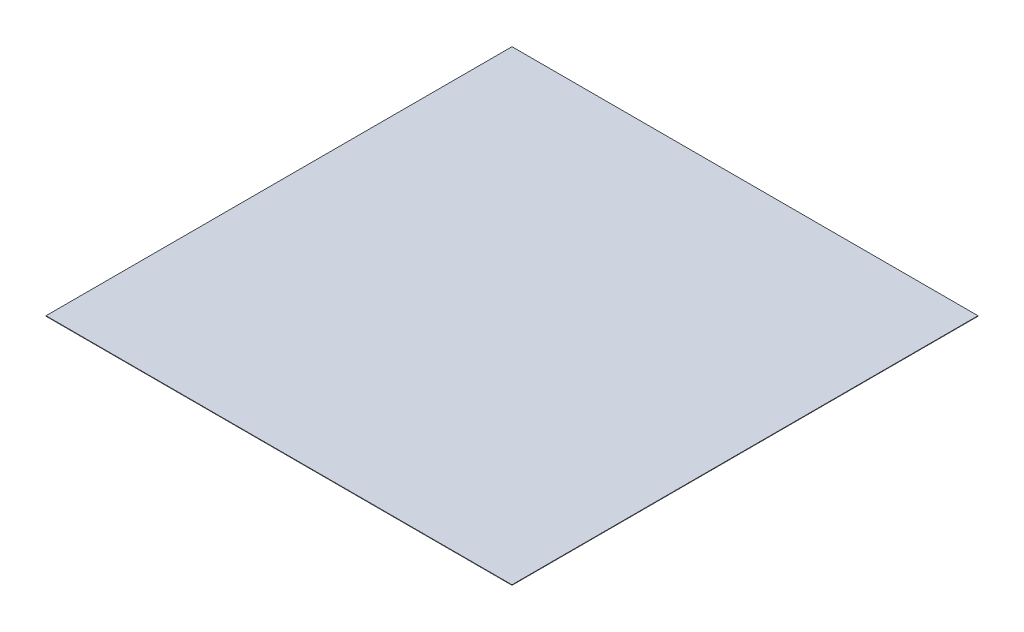
ISO-10303-21;
HEADER;
FILE_DESCRIPTION(('STEP AP214'),'2;1');
FILE_NAME('part.step','',(''),(''),'','','');
FILE_SCHEMA(('AUTOMOTIVE_DESIGN { 1 0 10303 214 1 1 1 1 }'));
ENDSEC;
DATA;
#1=APPLICATION_CONTEXT('core data for automotive mechanical design processes');
#2=APPLICATION_PROTOCOL_DEFINITION('international standard','automotive_design',2000,#1);
#3=PRODUCT_CONTEXT('',#1,'mechanical');
#4=PRODUCT('Part','Part','',(#3));
#5=PRODUCT_RELATED_PRODUCT_CATEGORY('part','',(#4));
#6=PRODUCT_DEFINITION_FORMATION('','',#4);
#7=PRODUCT_DEFINITION_CONTEXT('part definition',#1,'design');
#8=PRODUCT_DEFINITION('design','',#6,#7);
#9=PRODUCT_DEFINITION_SHAPE('','',#8);
#10=(LENGTH_UNIT() NAMED_UNIT(*) SI_UNIT(.MILLI.,.METRE.));
#11=(NAMED_UNIT(*) PLANE_ANGLE_UNIT() SI_UNIT($,.RADIAN.));
#12=(NAMED_UNIT(*) SI_UNIT($,.STERADIAN.) SOLID_ANGLE_UNIT());
#13=UNCERTAINTY_MEASURE_WITH_UNIT(LENGTH_MEASURE(1.E-05),#10,'distance_accuracy_value','');
#14=(GEOMETRIC_REPRESENTATION_CONTEXT(3) GLOBAL_UNCERTAINTY_ASSIGNED_CONTEXT((#13)) GLOBAL_UNIT_ASSIGNED_CONTEXT((#10,
#11,#12)) REPRESENTATION_CONTEXT('',''));
#15=CARTESIAN_POINT('',(0.,0.,0.));
#16=DIRECTION('',(0.,0.,1.));
#17=DIRECTION('',(1.,0.,0.));
#18=AXIS2_PLACEMENT_3D('',#15,#16,#17);
#19=CARTESIAN_POINT('',(5000.,10.,5000.));
#20=DIRECTION('',(-1.,0.,0.));
#21=DIRECTION('',(0.,0.,1.));
#22=AXIS2_PLACEMENT_3D('',#19,#20,#21);
#23=PLANE('',#22);
#24=DIRECTION('',(0.,0.,-1.));
#25=VECTOR('',#24,1.);
#26=CARTESIAN_POINT('',(5000.,0.,5000.));
#27=LINE('',#26,#25);
#28=CARTESIAN_POINT('',(5000.,0.,5000.));
#29=VERTEX_POINT('',#28);
#30=CARTESIAN_POINT('',(5000.,0.,-5000.));
#31=VERTEX_POINT('',#30);
#32=EDGE_CURVE('E100',#29,#31,#27,.T.);
#33=ORIENTED_EDGE('',*,*,#32,.T.);
#34=DIRECTION('',(0.,-1.,0.));
#35=VECTOR('',#34,1.);
#36=CARTESIAN_POINT('',(5000.,10.,-5000.));
#37=LINE('',#36,#35);
#38=CARTESIAN_POINT('',(5000.,10.,-5000.));
#39=VERTEX_POINT('',#38);
#40=EDGE_CURVE('E11',#39,#31,#37,.T.);
#41=ORIENTED_EDGE('',*,*,#40,.F.);
#42=DIRECTION('',(0.,0.,-1.));
#43=VECTOR('',#42,1.);
#44=CARTESIAN_POINT('',(5000.,10.,5000.));
#45=LINE('',#44,#43);
#46=CARTESIAN_POINT('',(5000.,10.,5000.));
#47=VERTEX_POINT('',#46);
#48=EDGE_CURVE('E88',#47,#39,#45,.T.);
#49=ORIENTED_EDGE('',*,*,#48,.F.);
#50=DIRECTION('',(0.,-1.,0.));
#51=VECTOR('',#50,1.);
#52=CARTESIAN_POINT('',(5000.,10.,5000.));
#53=LINE('',#52,#51);
#54=EDGE_CURVE('E96',#47,#29,#53,.T.);
#55=ORIENTED_EDGE('',*,*,#54,.T.);
#56=EDGE_LOOP('',(#33,#41,#49,#55));
#57=FACE_BOUND('',#56,.T.);
#58=ADVANCED_FACE('F37',(#57),#23,.F.);
#59=CARTESIAN_POINT('',(-5000.,10.,-5000.));
#60=DIRECTION('',(0.,0.,1.));
#61=DIRECTION('',(1.,0.,0.));
#62=AXIS2_PLACEMENT_3D('',#59,#60,#61);
#63=PLANE('',#62);
#64=DIRECTION('',(-1.,0.,0.));
#65=VECTOR('',#64,1.);
#66=CARTESIAN_POINT('',(-5000.,0.,-5000.));
#67=LINE('',#66,#65);
#68=CARTESIAN_POINT('',(-5000.,0.,-5000.));
#69=VERTEX_POINT('',#68);
#70=EDGE_CURVE('E92',#31,#69,#67,.T.);
#71=ORIENTED_EDGE('',*,*,#70,.T.);
#72=DIRECTION('',(0.,-1.,0.));
#73=VECTOR('',#72,1.);
#74=CARTESIAN_POINT('',(-5000.,10.,-5000.));
#75=LINE('',#74,#73);
#76=CARTESIAN_POINT('',(-5000.,10.,-5000.));
#77=VERTEX_POINT('',#76);
#78=EDGE_CURVE('E45',#77,#69,#75,.T.);
#79=ORIENTED_EDGE('',*,*,#78,.F.);
#80=DIRECTION('',(-1.,0.,0.));
#81=VECTOR('',#80,1.);
#82=CARTESIAN_POINT('',(-5000.,10.,-5000.));
#83=LINE('',#82,#81);
#84=EDGE_CURVE('E83',#39,#77,#83,.T.);
#85=ORIENTED_EDGE('',*,*,#84,.F.);
#86=ORIENTED_EDGE('',*,*,#40,.T.);
#87=EDGE_LOOP('',(#71,#79,#85,#86));
#88=FACE_BOUND('',#87,.T.);
#89=ADVANCED_FACE('F91',(#88),#63,.F.);
#90=CARTESIAN_POINT('',(-5000.,10.,5000.));
#91=DIRECTION('',(1.,0.,0.));
#92=DIRECTION('',(0.,0.,-1.));
#93=AXIS2_PLACEMENT_3D('',#90,#91,#92);
#94=PLANE('',#93);
#95=DIRECTION('',(0.,0.,1.));
#96=VECTOR('',#95,1.);
#97=CARTESIAN_POINT('',(-5000.,0.,5000.));
#98=LINE('',#97,#96);
#99=CARTESIAN_POINT('',(-5000.,0.,5000.));
#100=VERTEX_POINT('',#99);
#101=EDGE_CURVE('E70',#69,#100,#98,.T.);
#102=ORIENTED_EDGE('',*,*,#101,.T.);
#103=DIRECTION('',(0.,-1.,0.));
#104=VECTOR('',#103,1.);
#105=CARTESIAN_POINT('',(-5000.,10.,5000.));
#106=LINE('',#105,#104);
#107=CARTESIAN_POINT('',(-5000.,10.,5000.));
#108=VERTEX_POINT('',#107);
#109=EDGE_CURVE('E93',#108,#100,#106,.T.);
#110=ORIENTED_EDGE('',*,*,#109,.F.);
#111=DIRECTION('',(0.,0.,1.));
#112=VECTOR('',#111,1.);
#113=CARTESIAN_POINT('',(-5000.,10.,5000.));
#114=LINE('',#113,#112);
#115=EDGE_CURVE('E86',#77,#108,#114,.T.);
#116=ORIENTED_EDGE('',*,*,#115,.F.);
#117=ORIENTED_EDGE('',*,*,#78,.T.);
#118=EDGE_LOOP('',(#102,#110,#116,#117));
#119=FACE_BOUND('',#118,.T.);
#120=ADVANCED_FACE('F94',(#119),#94,.F.);
#121=CARTESIAN_POINT('',(-5000.,10.,5000.));
#122=DIRECTION('',(0.,0.,-1.));
#123=DIRECTION('',(-1.,0.,0.));
#124=AXIS2_PLACEMENT_3D('',#121,#122,#123);
#125=PLANE('',#124);
#126=DIRECTION('',(1.,0.,0.));
#127=VECTOR('',#126,1.);
#128=CARTESIAN_POINT('',(-5000.,0.,5000.));
#129=LINE('',#128,#127);
#130=EDGE_CURVE('E76',#100,#29,#129,.T.);
#131=ORIENTED_EDGE('',*,*,#130,.T.);
#132=ORIENTED_EDGE('',*,*,#54,.F.);
#133=DIRECTION('',(1.,0.,0.));
#134=VECTOR('',#133,1.);
#135=CARTESIAN_POINT('',(-5000.,10.,5000.));
#136=LINE('',#135,#134);
#137=EDGE_CURVE('E53',#108,#47,#136,.T.);
#138=ORIENTED_EDGE('',*,*,#137,.F.);
#139=ORIENTED_EDGE('',*,*,#109,.T.);
#140=EDGE_LOOP('',(#131,#132,#138,#139));
#141=FACE_BOUND('',#140,.T.);
#142=ADVANCED_FACE('F107',(#141),#125,.F.);
#143=CARTESIAN_POINT('',(0.,10.,0.));
#144=DIRECTION('',(0.,-1.,0.));
#145=DIRECTION('',(0.,0.,-1.));
#146=AXIS2_PLACEMENT_3D('',#143,#144,#145);
#147=PLANE('',#146);
#148=ORIENTED_EDGE('',*,*,#48,.T.);
#149=ORIENTED_EDGE('',*,*,#84,.T.);
#150=ORIENTED_EDGE('',*,*,#115,.T.);
#151=ORIENTED_EDGE('',*,*,#137,.T.);
#152=EDGE_LOOP('',(#148,#149,#150,#151));
#153=FACE_BOUND('',#152,.T.);
#154=ADVANCED_FACE('F84',(#153),#147,.F.);
#155=CARTESIAN_POINT('',(0.,0.,0.));
#156=DIRECTION('',(0.,-1.,0.));
#157=DIRECTION('',(0.,0.,-1.));
#158=AXIS2_PLACEMENT_3D('',#155,#156,#157);
#159=PLANE('',#158);
#160=ORIENTED_EDGE('',*,*,#32,.F.);
#161=ORIENTED_EDGE('',*,*,#130,.F.);
#162=ORIENTED_EDGE('',*,*,#101,.F.);
#163=ORIENTED_EDGE('',*,*,#70,.F.);
#164=EDGE_LOOP('',(#160,#161,#162,#163));
#165=FACE_BOUND('',#164,.T.);
#166=ADVANCED_FACE('F110',(#165),#159,.T.);
#167=CLOSED_SHELL('',(#58,#89,#120,#142,#154,#166));
#168=MANIFOLD_SOLID_BREP('B2',#167);
#169=ADVANCED_BREP_SHAPE_REPRESENTATION('',(#18,#168),#14);
#170=SHAPE_DEFINITION_REPRESENTATION(#9,#169);
ENDSEC;
END-ISO-10303-21;
